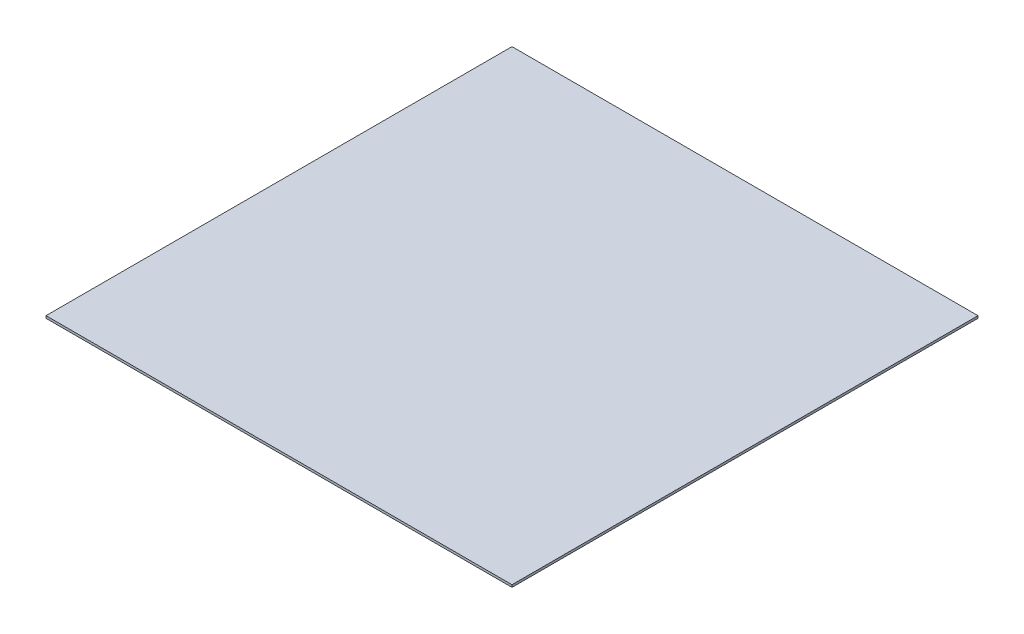
ISO-10303-21;
HEADER;
FILE_DESCRIPTION(('STEP AP214'),'2;1');
FILE_NAME('part.step','',(''),(''),'','','');
FILE_SCHEMA(('AUTOMOTIVE_DESIGN { 1 0 10303 214 1 1 1 1 }'));
ENDSEC;
DATA;
#1=APPLICATION_CONTEXT('core data for automotive mechanical design processes');
#2=APPLICATION_PROTOCOL_DEFINITION('international standard','automotive_design',2000,#1);
#3=PRODUCT_CONTEXT('',#1,'mechanical');
#4=PRODUCT('Part','Part','',(#3));
#5=PRODUCT_RELATED_PRODUCT_CATEGORY('part','',(#4));
#6=PRODUCT_DEFINITION_FORMATION('','',#4);
#7=PRODUCT_DEFINITION_CONTEXT('part definition',#1,'design');
#8=PRODUCT_DEFINITION('design','',#6,#7);
#9=PRODUCT_DEFINITION_SHAPE('','',#8);
#10=(LENGTH_UNIT() NAMED_UNIT(*) SI_UNIT(.MILLI.,.METRE.));
#11=(NAMED_UNIT(*) PLANE_ANGLE_UNIT() SI_UNIT($,.RADIAN.));
#12=(NAMED_UNIT(*) SI_UNIT($,.STERADIAN.) SOLID_ANGLE_UNIT());
#13=UNCERTAINTY_MEASURE_WITH_UNIT(LENGTH_MEASURE(1.E-05),#10,'distance_accuracy_value','');
#14=(GEOMETRIC_REPRESENTATION_CONTEXT(3) GLOBAL_UNCERTAINTY_ASSIGNED_CONTEXT((#13)) GLOBAL_UNIT_ASSIGNED_CONTEXT((#10,
#11,#12)) REPRESENTATION_CONTEXT('',''));
#15=CARTESIAN_POINT('',(0.,0.,0.));
#16=DIRECTION('',(0.,0.,1.));
#17=DIRECTION('',(1.,0.,0.));
#18=AXIS2_PLACEMENT_3D('',#15,#16,#17);
#19=CARTESIAN_POINT('',(0.,10.,0.));
#20=DIRECTION('',(-1.,0.,0.));
#21=DIRECTION('',(0.,0.,1.));
#22=AXIS2_PLACEMENT_3D('',#19,#20,#21);
#23=PLANE('',#22);
#24=DIRECTION('',(0.,0.,-1.));
#25=VECTOR('',#24,1.);
#26=CARTESIAN_POINT('',(0.,0.,0.));
#27=LINE('',#26,#25);
#28=CARTESIAN_POINT('',(0.,0.,2000.));
#29=VERTEX_POINT('',#28);
#30=CARTESIAN_POINT('',(0.,0.,0.));
#31=VERTEX_POINT('',#30);
#32=EDGE_CURVE('E111',#29,#31,#27,.T.);
#33=ORIENTED_EDGE('',*,*,#32,.T.);
#34=DIRECTION('',(0.,-1.,0.));
#35=VECTOR('',#34,1.);
#36=CARTESIAN_POINT('',(0.,10.,0.));
#37=LINE('',#36,#35);
#38=CARTESIAN_POINT('',(0.,10.,0.));
#39=VERTEX_POINT('',#38);
#40=EDGE_CURVE('E11',#39,#31,#37,.T.);
#41=ORIENTED_EDGE('',*,*,#40,.F.);
#42=DIRECTION('',(0.,0.,-1.));
#43=VECTOR('',#42,1.);
#44=CARTESIAN_POINT('',(0.,10.,0.));
#45=LINE('',#44,#43);
#46=CARTESIAN_POINT('',(0.,10.,2000.));
#47=VERTEX_POINT('',#46);
#48=EDGE_CURVE('E95',#47,#39,#45,.T.);
#49=ORIENTED_EDGE('',*,*,#48,.F.);
#50=DIRECTION('',(0.,-1.,0.));
#51=VECTOR('',#50,1.);
#52=CARTESIAN_POINT('',(0.,10.,2000.));
#53=LINE('',#52,#51);
#54=EDGE_CURVE('E107',#47,#29,#53,.T.);
#55=ORIENTED_EDGE('',*,*,#54,.T.);
#56=EDGE_LOOP('',(#33,#41,#49,#55));
#57=FACE_BOUND('',#56,.T.);
#58=ADVANCED_FACE('F43',(#57),#23,.F.);
#59=CARTESIAN_POINT('',(0.,10.,0.));
#60=DIRECTION('',(0.,0.,1.));
#61=DIRECTION('',(1.,0.,0.));
#62=AXIS2_PLACEMENT_3D('',#59,#60,#61);
#63=PLANE('',#62);
#64=DIRECTION('',(-1.,0.,0.));
#65=VECTOR('',#64,1.);
#66=CARTESIAN_POINT('',(0.,0.,0.));
#67=LINE('',#66,#65);
#68=CARTESIAN_POINT('',(-2000.,0.,0.));
#69=VERTEX_POINT('',#68);
#70=EDGE_CURVE('E100',#31,#69,#67,.T.);
#71=ORIENTED_EDGE('',*,*,#70,.T.);
#72=DIRECTION('',(0.,-1.,0.));
#73=VECTOR('',#72,1.);
#74=CARTESIAN_POINT('',(-2000.,10.,0.));
#75=LINE('',#74,#73);
#76=CARTESIAN_POINT('',(-2000.,10.,0.));
#77=VERTEX_POINT('',#76);
#78=EDGE_CURVE('E52',#77,#69,#75,.T.);
#79=ORIENTED_EDGE('',*,*,#78,.F.);
#80=DIRECTION('',(-1.,0.,0.));
#81=VECTOR('',#80,1.);
#82=CARTESIAN_POINT('',(0.,10.,0.));
#83=LINE('',#82,#81);
#84=EDGE_CURVE('E90',#39,#77,#83,.T.);
#85=ORIENTED_EDGE('',*,*,#84,.F.);
#86=ORIENTED_EDGE('',*,*,#40,.T.);
#87=EDGE_LOOP('',(#71,#79,#85,#86));
#88=FACE_BOUND('',#87,.T.);
#89=ADVANCED_FACE('F99',(#88),#63,.F.);
#90=CARTESIAN_POINT('',(-2000.,10.,0.));
#91=DIRECTION('',(1.,0.,0.));
#92=DIRECTION('',(0.,0.,-1.));
#93=AXIS2_PLACEMENT_3D('',#90,#91,#92);
#94=PLANE('',#93);
#95=DIRECTION('',(0.,0.,1.));
#96=VECTOR('',#95,1.);
#97=CARTESIAN_POINT('',(-2000.,0.,0.));
#98=LINE('',#97,#96);
#99=CARTESIAN_POINT('',(-2000.,0.,2000.));
#100=VERTEX_POINT('',#99);
#101=EDGE_CURVE('E77',#69,#100,#98,.T.);
#102=ORIENTED_EDGE('',*,*,#101,.T.);
#103=DIRECTION('',(0.,-1.,0.));
#104=VECTOR('',#103,1.);
#105=CARTESIAN_POINT('',(-2000.,10.,2000.));
#106=LINE('',#105,#104);
#107=CARTESIAN_POINT('',(-2000.,10.,2000.));
#108=VERTEX_POINT('',#107);
#109=EDGE_CURVE('E102',#108,#100,#106,.T.);
#110=ORIENTED_EDGE('',*,*,#109,.F.);
#111=DIRECTION('',(0.,0.,1.));
#112=VECTOR('',#111,1.);
#113=CARTESIAN_POINT('',(-2000.,10.,0.));
#114=LINE('',#113,#112);
#115=EDGE_CURVE('E93',#77,#108,#114,.T.);
#116=ORIENTED_EDGE('',*,*,#115,.F.);
#117=ORIENTED_EDGE('',*,*,#78,.T.);
#118=EDGE_LOOP('',(#102,#110,#116,#117));
#119=FACE_BOUND('',#118,.T.);
#120=ADVANCED_FACE('F103',(#119),#94,.F.);
#121=CARTESIAN_POINT('',(0.,10.,2000.));
#122=DIRECTION('',(0.,0.,-1.));
#123=DIRECTION('',(-1.,0.,0.));
#124=AXIS2_PLACEMENT_3D('',#121,#122,#123);
#125=PLANE('',#124);
#126=DIRECTION('',(1.,0.,0.));
#127=VECTOR('',#126,1.);
#128=CARTESIAN_POINT('',(0.,0.,2000.));
#129=LINE('',#128,#127);
#130=EDGE_CURVE('E83',#100,#29,#129,.T.);
#131=ORIENTED_EDGE('',*,*,#130,.T.);
#132=ORIENTED_EDGE('',*,*,#54,.F.);
#133=DIRECTION('',(1.,0.,0.));
#134=VECTOR('',#133,1.);
#135=CARTESIAN_POINT('',(0.,10.,2000.));
#136=LINE('',#135,#134);
#137=EDGE_CURVE('E60',#108,#47,#136,.T.);
#138=ORIENTED_EDGE('',*,*,#137,.F.);
#139=ORIENTED_EDGE('',*,*,#109,.T.);
#140=EDGE_LOOP('',(#131,#132,#138,#139));
#141=FACE_BOUND('',#140,.T.);
#142=ADVANCED_FACE('F124',(#141),#125,.F.);
#143=CARTESIAN_POINT('',(0.,10.,0.));
#144=DIRECTION('',(0.,-1.,0.));
#145=DIRECTION('',(0.,0.,-1.));
#146=AXIS2_PLACEMENT_3D('',#143,#144,#145);
#147=PLANE('',#146);
#148=ORIENTED_EDGE('',*,*,#48,.T.);
#149=ORIENTED_EDGE('',*,*,#84,.T.);
#150=ORIENTED_EDGE('',*,*,#115,.T.);
#151=ORIENTED_EDGE('',*,*,#137,.T.);
#152=EDGE_LOOP('',(#148,#149,#150,#151));
#153=FACE_BOUND('',#152,.T.);
#154=ADVANCED_FACE('F91',(#153),#147,.F.);
#155=CARTESIAN_POINT('',(0.,0.,0.));
#156=DIRECTION('',(0.,-1.,0.));
#157=DIRECTION('',(0.,0.,-1.));
#158=AXIS2_PLACEMENT_3D('',#155,#156,#157);
#159=PLANE('',#158);
#160=ORIENTED_EDGE('',*,*,#32,.F.);
#161=ORIENTED_EDGE('',*,*,#130,.F.);
#162=ORIENTED_EDGE('',*,*,#101,.F.);
#163=ORIENTED_EDGE('',*,*,#70,.F.);
#164=EDGE_LOOP('',(#160,#161,#162,#163));
#165=FACE_BOUND('',#164,.T.);
#166=ADVANCED_FACE('F127',(#165),#159,.T.);
#167=CLOSED_SHELL('',(#58,#89,#120,#142,#154,#166));
#168=MANIFOLD_SOLID_BREP('B2',#167);
#169=ADVANCED_BREP_SHAPE_REPRESENTATION('',(#18,#168),#14);
#170=SHAPE_DEFINITION_REPRESENTATION(#9,#169);
ENDSEC;
END-ISO-10303-21;
